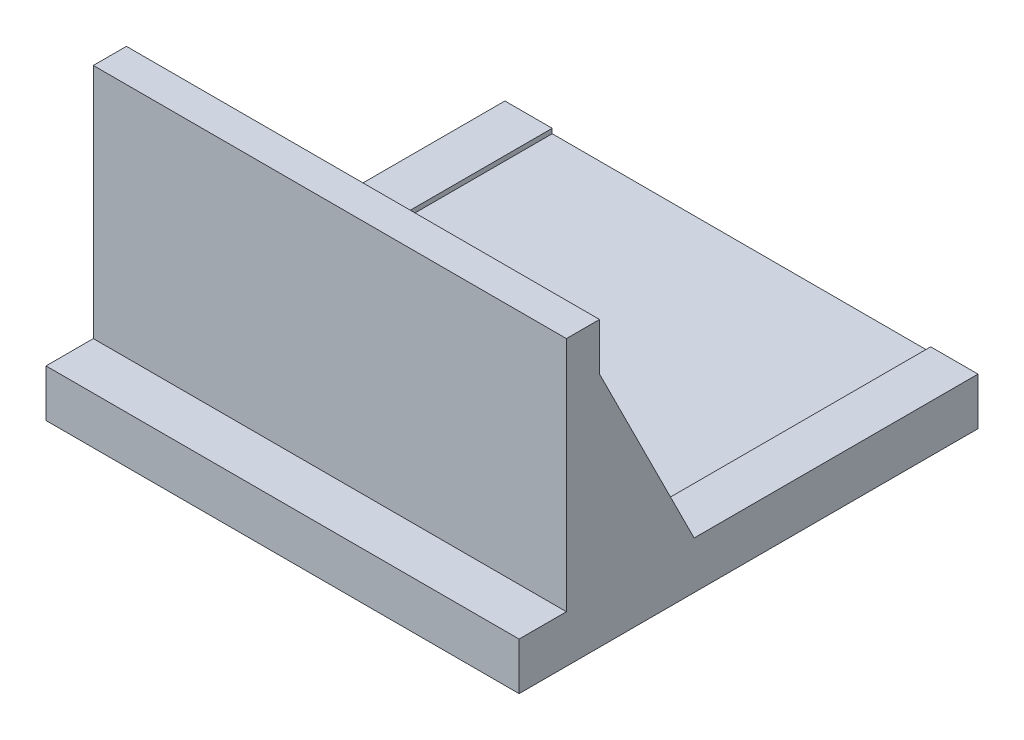
ISO-10303-21;
HEADER;
FILE_DESCRIPTION(('STEP AP214'),'2;1');
FILE_NAME('part.step','',(''),(''),'','','');
FILE_SCHEMA(('AUTOMOTIVE_DESIGN { 1 0 10303 214 1 1 1 1 }'));
ENDSEC;
DATA;
#1=APPLICATION_CONTEXT('core data for automotive mechanical design processes');
#2=APPLICATION_PROTOCOL_DEFINITION('international standard','automotive_design',2000,#1);
#3=PRODUCT_CONTEXT('',#1,'mechanical');
#4=PRODUCT('Part','Part','',(#3));
#5=PRODUCT_RELATED_PRODUCT_CATEGORY('part','',(#4));
#6=PRODUCT_DEFINITION_FORMATION('','',#4);
#7=PRODUCT_DEFINITION_CONTEXT('part definition',#1,'design');
#8=PRODUCT_DEFINITION('design','',#6,#7);
#9=PRODUCT_DEFINITION_SHAPE('','',#8);
#10=(LENGTH_UNIT() NAMED_UNIT(*) SI_UNIT(.MILLI.,.METRE.));
#11=(NAMED_UNIT(*) PLANE_ANGLE_UNIT() SI_UNIT($,.RADIAN.));
#12=(NAMED_UNIT(*) SI_UNIT($,.STERADIAN.) SOLID_ANGLE_UNIT());
#13=UNCERTAINTY_MEASURE_WITH_UNIT(LENGTH_MEASURE(1.E-05),#10,'distance_accuracy_value','');
#14=(GEOMETRIC_REPRESENTATION_CONTEXT(3) GLOBAL_UNCERTAINTY_ASSIGNED_CONTEXT((#13)) GLOBAL_UNIT_ASSIGNED_CONTEXT((#10,
#11,#12)) REPRESENTATION_CONTEXT('',''));
#15=CARTESIAN_POINT('',(0.,0.,0.));
#16=DIRECTION('',(0.,0.,1.));
#17=DIRECTION('',(1.,0.,0.));
#18=AXIS2_PLACEMENT_3D('',#15,#16,#17);
#19=CARTESIAN_POINT('',(50.,-30.,37.));
#20=DIRECTION('',(-1.,0.,0.));
#21=DIRECTION('',(0.,0.,1.));
#22=AXIS2_PLACEMENT_3D('',#19,#20,#21);
#23=PLANE('',#22);
#24=DIRECTION('',(0.,0.894427190999916,0.447213595499958));
#25=VECTOR('',#24,1.);
#26=CARTESIAN_POINT('',(50.,-4.,8.));
#27=LINE('',#26,#25);
#28=CARTESIAN_POINT('',(50.,-20.,0.));
#29=VERTEX_POINT('',#28);
#30=CARTESIAN_POINT('',(50.,20.,20.));
#31=VERTEX_POINT('',#30);
#32=EDGE_CURVE('E188',#29,#31,#27,.T.);
#33=ORIENTED_EDGE('',*,*,#32,.T.);
#34=DIRECTION('',(0.,-1.,0.));
#35=VECTOR('',#34,1.);
#36=CARTESIAN_POINT('',(50.,0.,20.));
#37=LINE('',#36,#35);
#38=CARTESIAN_POINT('',(50.,30.,20.));
#39=VERTEX_POINT('',#38);
#40=EDGE_CURVE('E193',#39,#31,#37,.T.);
#41=ORIENTED_EDGE('',*,*,#40,.F.);
#42=DIRECTION('',(0.,0.,-1.));
#43=VECTOR('',#42,1.);
#44=CARTESIAN_POINT('',(50.,30.,37.));
#45=LINE('',#44,#43);
#46=CARTESIAN_POINT('',(50.,30.,27.));
#47=VERTEX_POINT('',#46);
#48=EDGE_CURVE('E11',#47,#39,#45,.T.);
#49=ORIENTED_EDGE('',*,*,#48,.F.);
#50=DIRECTION('',(0.,1.,0.));
#51=VECTOR('',#50,1.);
#52=CARTESIAN_POINT('',(50.,30.,27.));
#53=LINE('',#52,#51);
#54=CARTESIAN_POINT('',(50.,-20.,27.));
#55=VERTEX_POINT('',#54);
#56=EDGE_CURVE('E229',#55,#47,#53,.T.);
#57=ORIENTED_EDGE('',*,*,#56,.F.);
#58=DIRECTION('',(0.,0.,-1.));
#59=VECTOR('',#58,1.);
#60=CARTESIAN_POINT('',(50.,-20.,37.));
#61=LINE('',#60,#59);
#62=CARTESIAN_POINT('',(50.,-20.,37.));
#63=VERTEX_POINT('',#62);
#64=EDGE_CURVE('E222',#63,#55,#61,.T.);
#65=ORIENTED_EDGE('',*,*,#64,.F.);
#66=DIRECTION('',(0.,1.,0.));
#67=VECTOR('',#66,1.);
#68=CARTESIAN_POINT('',(50.,-30.,37.));
#69=LINE('',#68,#67);
#70=CARTESIAN_POINT('',(50.,-30.,37.));
#71=VERTEX_POINT('',#70);
#72=EDGE_CURVE('E243',#71,#63,#69,.T.);
#73=ORIENTED_EDGE('',*,*,#72,.F.);
#74=DIRECTION('',(0.,0.,-1.));
#75=VECTOR('',#74,1.);
#76=CARTESIAN_POINT('',(50.,-30.,37.));
#77=LINE('',#76,#75);
#78=CARTESIAN_POINT('',(50.,-30.,-60.));
#79=VERTEX_POINT('',#78);
#80=EDGE_CURVE('E258',#71,#79,#77,.T.);
#81=ORIENTED_EDGE('',*,*,#80,.T.);
#82=DIRECTION('',(0.,-1.,0.));
#83=VECTOR('',#82,1.);
#84=CARTESIAN_POINT('',(50.,0.,-60.));
#85=LINE('',#84,#83);
#86=CARTESIAN_POINT('',(50.,-20.,-60.));
#87=VERTEX_POINT('',#86);
#88=EDGE_CURVE('E293',#87,#79,#85,.T.);
#89=ORIENTED_EDGE('',*,*,#88,.F.);
#90=DIRECTION('',(0.,0.,1.));
#91=VECTOR('',#90,1.);
#92=CARTESIAN_POINT('',(50.,-20.,-60.));
#93=LINE('',#92,#91);
#94=EDGE_CURVE('E178',#87,#29,#93,.T.);
#95=ORIENTED_EDGE('',*,*,#94,.T.);
#96=EDGE_LOOP('',(#33,#41,#49,#57,#65,#73,#81,#89,#95));
#97=FACE_BOUND('',#96,.T.);
#98=ADVANCED_FACE('F41',(#97),#23,.F.);
#99=CARTESIAN_POINT('',(-50.,-30.,37.));
#100=DIRECTION('',(1.,0.,0.));
#101=DIRECTION('',(0.,0.,-1.));
#102=AXIS2_PLACEMENT_3D('',#99,#100,#101);
#103=PLANE('',#102);
#104=DIRECTION('',(0.,0.894427190999916,0.447213595499958));
#105=VECTOR('',#104,1.);
#106=CARTESIAN_POINT('',(-50.,-4.,8.));
#107=LINE('',#106,#105);
#108=CARTESIAN_POINT('',(-50.,-20.,0.));
#109=VERTEX_POINT('',#108);
#110=CARTESIAN_POINT('',(-50.,20.,20.));
#111=VERTEX_POINT('',#110);
#112=EDGE_CURVE('E189',#109,#111,#107,.T.);
#113=ORIENTED_EDGE('',*,*,#112,.F.);
#114=DIRECTION('',(0.,0.,1.));
#115=VECTOR('',#114,1.);
#116=CARTESIAN_POINT('',(-50.,-20.,-60.));
#117=LINE('',#116,#115);
#118=CARTESIAN_POINT('',(-50.,-20.,-60.));
#119=VERTEX_POINT('',#118);
#120=EDGE_CURVE('E302',#119,#109,#117,.T.);
#121=ORIENTED_EDGE('',*,*,#120,.F.);
#122=DIRECTION('',(0.,1.,0.));
#123=VECTOR('',#122,1.);
#124=CARTESIAN_POINT('',(-50.,0.,-60.));
#125=LINE('',#124,#123);
#126=CARTESIAN_POINT('',(-50.,-30.,-60.));
#127=VERTEX_POINT('',#126);
#128=EDGE_CURVE('E162',#127,#119,#125,.T.);
#129=ORIENTED_EDGE('',*,*,#128,.F.);
#130=DIRECTION('',(0.,0.,-1.));
#131=VECTOR('',#130,1.);
#132=CARTESIAN_POINT('',(-50.,-30.,37.));
#133=LINE('',#132,#131);
#134=CARTESIAN_POINT('',(-50.,-30.,37.));
#135=VERTEX_POINT('',#134);
#136=EDGE_CURVE('E261',#135,#127,#133,.T.);
#137=ORIENTED_EDGE('',*,*,#136,.F.);
#138=DIRECTION('',(0.,-1.,0.));
#139=VECTOR('',#138,1.);
#140=CARTESIAN_POINT('',(-50.,-30.,37.));
#141=LINE('',#140,#139);
#142=CARTESIAN_POINT('',(-50.,-20.,37.));
#143=VERTEX_POINT('',#142);
#144=EDGE_CURVE('E252',#143,#135,#141,.T.);
#145=ORIENTED_EDGE('',*,*,#144,.F.);
#146=DIRECTION('',(0.,0.,-1.));
#147=VECTOR('',#146,1.);
#148=CARTESIAN_POINT('',(-50.,-20.,37.));
#149=LINE('',#148,#147);
#150=CARTESIAN_POINT('',(-50.,-20.,27.));
#151=VERTEX_POINT('',#150);
#152=EDGE_CURVE('E64',#143,#151,#149,.T.);
#153=ORIENTED_EDGE('',*,*,#152,.T.);
#154=DIRECTION('',(0.,1.,0.));
#155=VECTOR('',#154,1.);
#156=CARTESIAN_POINT('',(-50.,30.,27.));
#157=LINE('',#156,#155);
#158=CARTESIAN_POINT('',(-50.,30.,27.));
#159=VERTEX_POINT('',#158);
#160=EDGE_CURVE('E228',#151,#159,#157,.T.);
#161=ORIENTED_EDGE('',*,*,#160,.T.);
#162=DIRECTION('',(0.,0.,-1.));
#163=VECTOR('',#162,1.);
#164=CARTESIAN_POINT('',(-50.,30.,37.));
#165=LINE('',#164,#163);
#166=CARTESIAN_POINT('',(-50.,30.,20.));
#167=VERTEX_POINT('',#166);
#168=EDGE_CURVE('E49',#159,#167,#165,.T.);
#169=ORIENTED_EDGE('',*,*,#168,.T.);
#170=DIRECTION('',(0.,-1.,0.));
#171=VECTOR('',#170,1.);
#172=CARTESIAN_POINT('',(-50.,0.,20.));
#173=LINE('',#172,#171);
#174=EDGE_CURVE('E192',#167,#111,#173,.T.);
#175=ORIENTED_EDGE('',*,*,#174,.T.);
#176=EDGE_LOOP('',(#113,#121,#129,#137,#145,#153,#161,#169,#175));
#177=FACE_BOUND('',#176,.T.);
#178=ADVANCED_FACE('F268',(#177),#103,.F.);
#179=CARTESIAN_POINT('',(-40.,-20.,0.));
#180=DIRECTION('',(-1.,0.,0.));
#181=DIRECTION('',(0.,0.,1.));
#182=AXIS2_PLACEMENT_3D('',#179,#180,#181);
#183=PLANE('',#182);
#184=DIRECTION('',(0.,-0.894427190999916,-0.447213595499958));
#185=VECTOR('',#184,1.);
#186=CARTESIAN_POINT('',(-40.,-20.,0.));
#187=LINE('',#186,#185);
#188=CARTESIAN_POINT('',(-40.,20.,20.));
#189=VERTEX_POINT('',#188);
#190=CARTESIAN_POINT('',(-40.,-20.,0.));
#191=VERTEX_POINT('',#190);
#192=EDGE_CURVE('E211',#189,#191,#187,.T.);
#193=ORIENTED_EDGE('',*,*,#192,.F.);
#194=DIRECTION('',(0.,1.,0.));
#195=VECTOR('',#194,1.);
#196=CARTESIAN_POINT('',(-40.,-20.,20.));
#197=LINE('',#196,#195);
#198=CARTESIAN_POINT('',(-40.,-21.,20.));
#199=VERTEX_POINT('',#198);
#200=EDGE_CURVE('E217',#199,#189,#197,.T.);
#201=ORIENTED_EDGE('',*,*,#200,.F.);
#202=DIRECTION('',(0.,0.,1.));
#203=VECTOR('',#202,1.);
#204=CARTESIAN_POINT('',(-40.,-21.,0.));
#205=LINE('',#204,#203);
#206=CARTESIAN_POINT('',(-40.,-21.,-60.));
#207=VERTEX_POINT('',#206);
#208=EDGE_CURVE('E150',#207,#199,#205,.T.);
#209=ORIENTED_EDGE('',*,*,#208,.F.);
#210=DIRECTION('',(0.,-1.,0.));
#211=VECTOR('',#210,1.);
#212=CARTESIAN_POINT('',(-40.,0.,-60.));
#213=LINE('',#212,#211);
#214=CARTESIAN_POINT('',(-40.,-20.,-60.));
#215=VERTEX_POINT('',#214);
#216=EDGE_CURVE('E142',#215,#207,#213,.T.);
#217=ORIENTED_EDGE('',*,*,#216,.F.);
#218=DIRECTION('',(0.,0.,1.));
#219=VECTOR('',#218,1.);
#220=CARTESIAN_POINT('',(-40.,-20.,-60.));
#221=LINE('',#220,#219);
#222=EDGE_CURVE('E147',#215,#191,#221,.T.);
#223=ORIENTED_EDGE('',*,*,#222,.T.);
#224=EDGE_LOOP('',(#193,#201,#209,#217,#223));
#225=FACE_BOUND('',#224,.T.);
#226=ADVANCED_FACE('F145',(#225),#183,.F.);
#227=CARTESIAN_POINT('',(40.,-20.,0.));
#228=DIRECTION('',(1.,0.,0.));
#229=DIRECTION('',(0.,0.,-1.));
#230=AXIS2_PLACEMENT_3D('',#227,#228,#229);
#231=PLANE('',#230);
#232=DIRECTION('',(0.,0.894427190999916,0.447213595499958));
#233=VECTOR('',#232,1.);
#234=CARTESIAN_POINT('',(40.,-20.,0.));
#235=LINE('',#234,#233);
#236=CARTESIAN_POINT('',(40.,-20.,0.));
#237=VERTEX_POINT('',#236);
#238=CARTESIAN_POINT('',(40.,20.,20.));
#239=VERTEX_POINT('',#238);
#240=EDGE_CURVE('E206',#237,#239,#235,.T.);
#241=ORIENTED_EDGE('',*,*,#240,.F.);
#242=DIRECTION('',(0.,0.,1.));
#243=VECTOR('',#242,1.);
#244=CARTESIAN_POINT('',(40.,-20.,-60.));
#245=LINE('',#244,#243);
#246=CARTESIAN_POINT('',(40.,-20.,-60.));
#247=VERTEX_POINT('',#246);
#248=EDGE_CURVE('E171',#247,#237,#245,.T.);
#249=ORIENTED_EDGE('',*,*,#248,.F.);
#250=DIRECTION('',(0.,1.,0.));
#251=VECTOR('',#250,1.);
#252=CARTESIAN_POINT('',(40.,0.,-60.));
#253=LINE('',#252,#251);
#254=CARTESIAN_POINT('',(40.,-21.,-60.));
#255=VERTEX_POINT('',#254);
#256=EDGE_CURVE('E285',#255,#247,#253,.T.);
#257=ORIENTED_EDGE('',*,*,#256,.F.);
#258=DIRECTION('',(0.,0.,-1.));
#259=VECTOR('',#258,1.);
#260=CARTESIAN_POINT('',(40.,-21.,0.));
#261=LINE('',#260,#259);
#262=CARTESIAN_POINT('',(40.,-21.,20.));
#263=VERTEX_POINT('',#262);
#264=EDGE_CURVE('E185',#263,#255,#261,.T.);
#265=ORIENTED_EDGE('',*,*,#264,.F.);
#266=DIRECTION('',(0.,1.,0.));
#267=VECTOR('',#266,1.);
#268=CARTESIAN_POINT('',(40.,-20.,20.));
#269=LINE('',#268,#267);
#270=EDGE_CURVE('E218',#263,#239,#269,.T.);
#271=ORIENTED_EDGE('',*,*,#270,.T.);
#272=EDGE_LOOP('',(#241,#249,#257,#265,#271));
#273=FACE_BOUND('',#272,.T.);
#274=ADVANCED_FACE('F335',(#273),#231,.F.);
#275=CARTESIAN_POINT('',(-50.,30.,37.));
#276=DIRECTION('',(0.,-1.,0.));
#277=DIRECTION('',(0.,0.,-1.));
#278=AXIS2_PLACEMENT_3D('',#275,#276,#277);
#279=PLANE('',#278);
#280=ORIENTED_EDGE('',*,*,#48,.T.);
#281=DIRECTION('',(1.,0.,0.));
#282=VECTOR('',#281,1.);
#283=CARTESIAN_POINT('',(-40.,30.,20.));
#284=LINE('',#283,#282);
#285=EDGE_CURVE('E214',#167,#39,#284,.T.);
#286=ORIENTED_EDGE('',*,*,#285,.F.);
#287=ORIENTED_EDGE('',*,*,#168,.F.);
#288=DIRECTION('',(1.,0.,0.));
#289=VECTOR('',#288,1.);
#290=CARTESIAN_POINT('',(-50.,30.,27.));
#291=LINE('',#290,#289);
#292=EDGE_CURVE('E239',#159,#47,#291,.T.);
#293=ORIENTED_EDGE('',*,*,#292,.T.);
#294=EDGE_LOOP('',(#280,#286,#287,#293));
#295=FACE_BOUND('',#294,.T.);
#296=ADVANCED_FACE('F272',(#295),#279,.F.);
#297=CARTESIAN_POINT('',(-50.,-30.,37.));
#298=DIRECTION('',(0.,1.,0.));
#299=DIRECTION('',(0.,0.,1.));
#300=AXIS2_PLACEMENT_3D('',#297,#298,#299);
#301=PLANE('',#300);
#302=ORIENTED_EDGE('',*,*,#136,.T.);
#303=DIRECTION('',(-1.,0.,0.));
#304=VECTOR('',#303,1.);
#305=CARTESIAN_POINT('',(0.,-30.,-60.));
#306=LINE('',#305,#304);
#307=EDGE_CURVE('E297',#79,#127,#306,.T.);
#308=ORIENTED_EDGE('',*,*,#307,.F.);
#309=ORIENTED_EDGE('',*,*,#80,.F.);
#310=DIRECTION('',(1.,0.,0.));
#311=VECTOR('',#310,1.);
#312=CARTESIAN_POINT('',(-50.,-30.,37.));
#313=LINE('',#312,#311);
#314=EDGE_CURVE('E255',#135,#71,#313,.T.);
#315=ORIENTED_EDGE('',*,*,#314,.F.);
#316=EDGE_LOOP('',(#302,#308,#309,#315));
#317=FACE_BOUND('',#316,.T.);
#318=ADVANCED_FACE('F333',(#317),#301,.F.);
#319=CARTESIAN_POINT('',(0.,0.,37.));
#320=DIRECTION('',(0.,0.,-1.));
#321=DIRECTION('',(-1.,0.,0.));
#322=AXIS2_PLACEMENT_3D('',#319,#320,#321);
#323=PLANE('',#322);
#324=ORIENTED_EDGE('',*,*,#72,.T.);
#325=DIRECTION('',(1.,0.,0.));
#326=VECTOR('',#325,1.);
#327=CARTESIAN_POINT('',(-50.,-20.,37.));
#328=LINE('',#327,#326);
#329=EDGE_CURVE('E233',#143,#63,#328,.T.);
#330=ORIENTED_EDGE('',*,*,#329,.F.);
#331=ORIENTED_EDGE('',*,*,#144,.T.);
#332=ORIENTED_EDGE('',*,*,#314,.T.);
#333=EDGE_LOOP('',(#324,#330,#331,#332));
#334=FACE_BOUND('',#333,.T.);
#335=ADVANCED_FACE('F327',(#334),#323,.F.);
#336=CARTESIAN_POINT('',(-50.,30.,27.));
#337=DIRECTION('',(0.,0.,-1.));
#338=DIRECTION('',(0.,1.,0.));
#339=AXIS2_PLACEMENT_3D('',#336,#337,#338);
#340=PLANE('',#339);
#341=ORIENTED_EDGE('',*,*,#56,.T.);
#342=ORIENTED_EDGE('',*,*,#292,.F.);
#343=ORIENTED_EDGE('',*,*,#160,.F.);
#344=DIRECTION('',(1.,0.,0.));
#345=VECTOR('',#344,1.);
#346=CARTESIAN_POINT('',(-50.,-20.,27.));
#347=LINE('',#346,#345);
#348=EDGE_CURVE('E244',#151,#55,#347,.T.);
#349=ORIENTED_EDGE('',*,*,#348,.T.);
#350=EDGE_LOOP('',(#341,#342,#343,#349));
#351=FACE_BOUND('',#350,.T.);
#352=ADVANCED_FACE('F323',(#351),#340,.F.);
#353=CARTESIAN_POINT('',(-50.,-20.,37.));
#354=DIRECTION('',(0.,-1.,0.));
#355=DIRECTION('',(0.,0.,-1.));
#356=AXIS2_PLACEMENT_3D('',#353,#354,#355);
#357=PLANE('',#356);
#358=ORIENTED_EDGE('',*,*,#64,.T.);
#359=ORIENTED_EDGE('',*,*,#348,.F.);
#360=ORIENTED_EDGE('',*,*,#152,.F.);
#361=ORIENTED_EDGE('',*,*,#329,.T.);
#362=EDGE_LOOP('',(#358,#359,#360,#361));
#363=FACE_BOUND('',#362,.T.);
#364=ADVANCED_FACE('F324',(#363),#357,.F.);
#365=CARTESIAN_POINT('',(-40.,-20.,20.));
#366=DIRECTION('',(0.,0.,1.));
#367=DIRECTION('',(1.,0.,0.));
#368=AXIS2_PLACEMENT_3D('',#365,#366,#367);
#369=PLANE('',#368);
#370=ORIENTED_EDGE('',*,*,#285,.T.);
#371=ORIENTED_EDGE('',*,*,#40,.T.);
#372=DIRECTION('',(1.,0.,0.));
#373=VECTOR('',#372,1.);
#374=CARTESIAN_POINT('',(-50.,20.,20.));
#375=LINE('',#374,#373);
#376=EDGE_CURVE('E56',#239,#31,#375,.T.);
#377=ORIENTED_EDGE('',*,*,#376,.F.);
#378=ORIENTED_EDGE('',*,*,#270,.F.);
#379=DIRECTION('',(1.,0.,0.));
#380=VECTOR('',#379,1.);
#381=CARTESIAN_POINT('',(-40.,-21.,20.));
#382=LINE('',#381,#380);
#383=EDGE_CURVE('E175',#199,#263,#382,.T.);
#384=ORIENTED_EDGE('',*,*,#383,.F.);
#385=ORIENTED_EDGE('',*,*,#200,.T.);
#386=EDGE_CURVE('E203',#111,#189,#375,.T.);
#387=ORIENTED_EDGE('',*,*,#386,.F.);
#388=ORIENTED_EDGE('',*,*,#174,.F.);
#389=EDGE_LOOP('',(#370,#371,#377,#378,#384,#385,#387,#388));
#390=FACE_BOUND('',#389,.T.);
#391=ADVANCED_FACE('F276',(#390),#369,.F.);
#392=CARTESIAN_POINT('',(-50.,-4.,8.));
#393=DIRECTION('',(0.,0.447213595499958,-0.894427190999916));
#394=DIRECTION('',(0.,0.894427190999916,0.447213595499958));
#395=AXIS2_PLACEMENT_3D('',#392,#393,#394);
#396=PLANE('',#395);
#397=ORIENTED_EDGE('',*,*,#240,.T.);
#398=ORIENTED_EDGE('',*,*,#376,.T.);
#399=ORIENTED_EDGE('',*,*,#32,.F.);
#400=DIRECTION('',(1.,0.,0.));
#401=VECTOR('',#400,1.);
#402=CARTESIAN_POINT('',(-50.,-20.,0.));
#403=LINE('',#402,#401);
#404=EDGE_CURVE('E197',#237,#29,#403,.T.);
#405=ORIENTED_EDGE('',*,*,#404,.F.);
#406=EDGE_LOOP('',(#397,#398,#399,#405));
#407=FACE_BOUND('',#406,.T.);
#408=ADVANCED_FACE('F318',(#407),#396,.T.);
#409=ORIENTED_EDGE('',*,*,#192,.T.);
#410=EDGE_CURVE('E169',#109,#191,#403,.T.);
#411=ORIENTED_EDGE('',*,*,#410,.F.);
#412=ORIENTED_EDGE('',*,*,#112,.T.);
#413=ORIENTED_EDGE('',*,*,#386,.T.);
#414=EDGE_LOOP('',(#409,#411,#412,#413));
#415=FACE_BOUND('',#414,.T.);
#416=ADVANCED_FACE('F279',(#415),#396,.T.);
#417=CARTESIAN_POINT('',(0.,-21.,0.));
#418=DIRECTION('',(0.,1.,0.));
#419=DIRECTION('',(0.,0.,1.));
#420=AXIS2_PLACEMENT_3D('',#417,#418,#419);
#421=PLANE('',#420);
#422=ORIENTED_EDGE('',*,*,#208,.T.);
#423=ORIENTED_EDGE('',*,*,#383,.T.);
#424=ORIENTED_EDGE('',*,*,#264,.T.);
#425=DIRECTION('',(1.,0.,0.));
#426=VECTOR('',#425,1.);
#427=CARTESIAN_POINT('',(0.,-21.,-60.));
#428=LINE('',#427,#426);
#429=EDGE_CURVE('E155',#207,#255,#428,.T.);
#430=ORIENTED_EDGE('',*,*,#429,.F.);
#431=EDGE_LOOP('',(#422,#423,#424,#430));
#432=FACE_BOUND('',#431,.T.);
#433=ADVANCED_FACE('F282',(#432),#421,.T.);
#434=CARTESIAN_POINT('',(0.,-20.,-60.));
#435=DIRECTION('',(0.,-1.,0.));
#436=DIRECTION('',(0.,0.,-1.));
#437=AXIS2_PLACEMENT_3D('',#434,#435,#436);
#438=PLANE('',#437);
#439=ORIENTED_EDGE('',*,*,#410,.T.);
#440=ORIENTED_EDGE('',*,*,#222,.F.);
#441=DIRECTION('',(1.,0.,0.));
#442=VECTOR('',#441,1.);
#443=CARTESIAN_POINT('',(0.,-20.,-60.));
#444=LINE('',#443,#442);
#445=EDGE_CURVE('E156',#119,#215,#444,.T.);
#446=ORIENTED_EDGE('',*,*,#445,.F.);
#447=ORIENTED_EDGE('',*,*,#120,.T.);
#448=EDGE_LOOP('',(#439,#440,#446,#447));
#449=FACE_BOUND('',#448,.T.);
#450=ADVANCED_FACE('F168',(#449),#438,.F.);
#451=CARTESIAN_POINT('',(0.,-20.,-60.));
#452=DIRECTION('',(0.,-1.,0.));
#453=DIRECTION('',(0.,0.,-1.));
#454=AXIS2_PLACEMENT_3D('',#451,#452,#453);
#455=PLANE('',#454);
#456=ORIENTED_EDGE('',*,*,#404,.T.);
#457=ORIENTED_EDGE('',*,*,#94,.F.);
#458=DIRECTION('',(1.,0.,0.));
#459=VECTOR('',#458,1.);
#460=CARTESIAN_POINT('',(0.,-20.,-60.));
#461=LINE('',#460,#459);
#462=EDGE_CURVE('E288',#247,#87,#461,.T.);
#463=ORIENTED_EDGE('',*,*,#462,.F.);
#464=ORIENTED_EDGE('',*,*,#248,.T.);
#465=EDGE_LOOP('',(#456,#457,#463,#464));
#466=FACE_BOUND('',#465,.T.);
#467=ADVANCED_FACE('F312',(#466),#455,.F.);
#468=CARTESIAN_POINT('',(0.,0.,-60.));
#469=DIRECTION('',(0.,0.,-1.));
#470=DIRECTION('',(-1.,0.,0.));
#471=AXIS2_PLACEMENT_3D('',#468,#469,#470);
#472=PLANE('',#471);
#473=ORIENTED_EDGE('',*,*,#445,.T.);
#474=ORIENTED_EDGE('',*,*,#216,.T.);
#475=ORIENTED_EDGE('',*,*,#429,.T.);
#476=ORIENTED_EDGE('',*,*,#256,.T.);
#477=ORIENTED_EDGE('',*,*,#462,.T.);
#478=ORIENTED_EDGE('',*,*,#88,.T.);
#479=ORIENTED_EDGE('',*,*,#307,.T.);
#480=ORIENTED_EDGE('',*,*,#128,.T.);
#481=EDGE_LOOP('',(#473,#474,#475,#476,#477,#478,#479,#480));
#482=FACE_BOUND('',#481,.T.);
#483=ADVANCED_FACE('F159',(#482),#472,.T.);
#484=CLOSED_SHELL('',(#98,#178,#226,#274,#296,#318,#335,#352,#364,#391,#408,#416,#433,#450,#467,#483));
#485=MANIFOLD_SOLID_BREP('B2',#484);
#486=ADVANCED_BREP_SHAPE_REPRESENTATION('',(#18,#485),#14);
#487=SHAPE_DEFINITION_REPRESENTATION(#9,#486);
ENDSEC;
END-ISO-10303-21;
